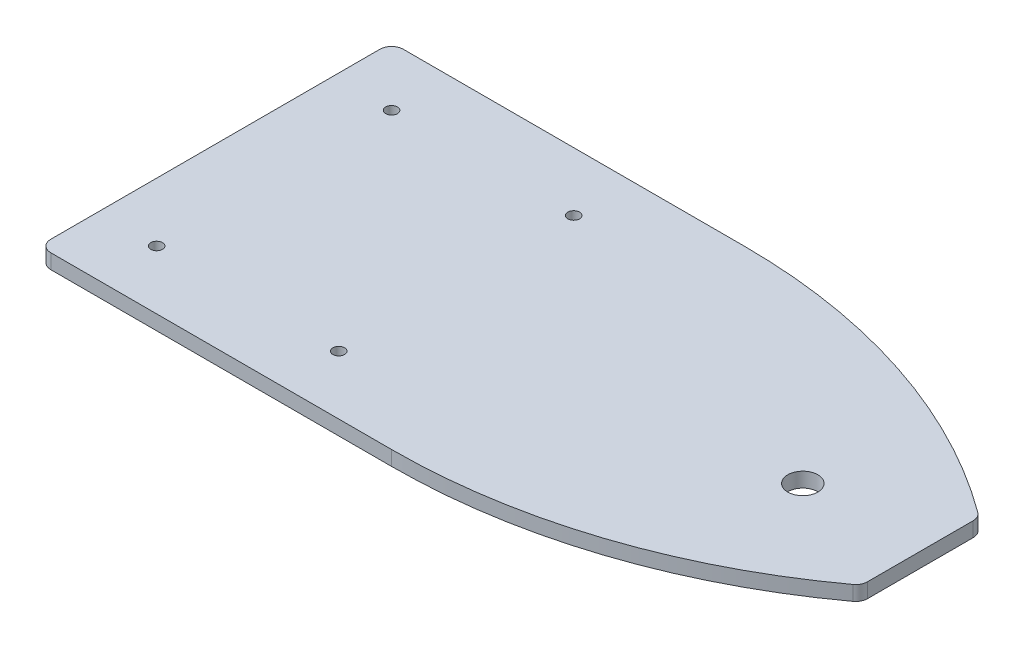
ISO-10303-21;
HEADER;
FILE_DESCRIPTION(('STEP AP214'),'2;1');
FILE_NAME('part.step','',(''),(''),'','','');
FILE_SCHEMA(('AUTOMOTIVE_DESIGN { 1 0 10303 214 1 1 1 1 }'));
ENDSEC;
DATA;
#1=APPLICATION_CONTEXT('core data for automotive mechanical design processes');
#2=APPLICATION_PROTOCOL_DEFINITION('international standard','automotive_design',2000,#1);
#3=PRODUCT_CONTEXT('',#1,'mechanical');
#4=PRODUCT('Part','Part','',(#3));
#5=PRODUCT_RELATED_PRODUCT_CATEGORY('part','',(#4));
#6=PRODUCT_DEFINITION_FORMATION('','',#4);
#7=PRODUCT_DEFINITION_CONTEXT('part definition',#1,'design');
#8=PRODUCT_DEFINITION('design','',#6,#7);
#9=PRODUCT_DEFINITION_SHAPE('','',#8);
#10=(LENGTH_UNIT() NAMED_UNIT(*) SI_UNIT(.MILLI.,.METRE.));
#11=(NAMED_UNIT(*) PLANE_ANGLE_UNIT() SI_UNIT($,.RADIAN.));
#12=(NAMED_UNIT(*) SI_UNIT($,.STERADIAN.) SOLID_ANGLE_UNIT());
#13=UNCERTAINTY_MEASURE_WITH_UNIT(LENGTH_MEASURE(1.E-05),#10,'distance_accuracy_value','');
#14=(GEOMETRIC_REPRESENTATION_CONTEXT(3) GLOBAL_UNCERTAINTY_ASSIGNED_CONTEXT((#13)) GLOBAL_UNIT_ASSIGNED_CONTEXT((#10,
#11,#12)) REPRESENTATION_CONTEXT('',''));
#15=CARTESIAN_POINT('',(0.,0.,0.));
#16=DIRECTION('',(0.,0.,1.));
#17=DIRECTION('',(1.,0.,0.));
#18=AXIS2_PLACEMENT_3D('',#15,#16,#17);
#19=CARTESIAN_POINT('',(76.2,3.175,38.1));
#20=DIRECTION('',(-1.,0.,0.));
#21=DIRECTION('',(0.,0.,1.));
#22=AXIS2_PLACEMENT_3D('',#19,#20,#21);
#23=PLANE('',#22);
#24=DIRECTION('',(0.,0.,-1.));
#25=VECTOR('',#24,1.);
#26=CARTESIAN_POINT('',(76.2,3.175,38.1));
#27=LINE('',#26,#25);
#28=CARTESIAN_POINT('',(76.2,3.175,11.421961703308));
#29=VERTEX_POINT('',#28);
#30=CARTESIAN_POINT('',(76.2,3.175,-11.421961703308));
#31=VERTEX_POINT('',#30);
#32=EDGE_CURVE('E196',#29,#31,#27,.T.);
#33=ORIENTED_EDGE('',*,*,#32,.F.);
#34=DIRECTION('',(0.,1.,0.));
#35=VECTOR('',#34,1.);
#36=CARTESIAN_POINT('',(76.2,3.175,11.421961703308));
#37=LINE('',#36,#35);
#38=CARTESIAN_POINT('',(76.2,0.,11.421961703308));
#39=VERTEX_POINT('',#38);
#40=EDGE_CURVE('E165',#29,#39,#37,.F.);
#41=ORIENTED_EDGE('',*,*,#40,.T.);
#42=DIRECTION('',(0.,0.,-1.));
#43=VECTOR('',#42,1.);
#44=CARTESIAN_POINT('',(76.2,0.,38.1));
#45=LINE('',#44,#43);
#46=CARTESIAN_POINT('',(76.2,0.,-11.421961703308));
#47=VERTEX_POINT('',#46);
#48=EDGE_CURVE('E143',#39,#47,#45,.T.);
#49=ORIENTED_EDGE('',*,*,#48,.T.);
#50=DIRECTION('',(0.,1.,0.));
#51=VECTOR('',#50,1.);
#52=CARTESIAN_POINT('',(76.2,3.175,-11.421961703308));
#53=LINE('',#52,#51);
#54=EDGE_CURVE('E163',#47,#31,#53,.T.);
#55=ORIENTED_EDGE('',*,*,#54,.T.);
#56=EDGE_LOOP('',(#33,#41,#49,#55));
#57=FACE_BOUND('',#56,.T.);
#58=ADVANCED_FACE('F43',(#57),#23,.F.);
#59=CARTESIAN_POINT('',(76.2,3.175,-38.1));
#60=DIRECTION('',(0.,0.,1.));
#61=DIRECTION('',(1.,0.,0.));
#62=AXIS2_PLACEMENT_3D('',#59,#60,#61);
#63=PLANE('',#62);
#64=DIRECTION('',(-1.,0.,0.));
#65=VECTOR('',#64,1.);
#66=CARTESIAN_POINT('',(76.2,0.,-38.1));
#67=LINE('',#66,#65);
#68=CARTESIAN_POINT('',(0.,0.,-38.1));
#69=VERTEX_POINT('',#68);
#70=CARTESIAN_POINT('',(-73.6599999999999,0.,-38.1));
#71=VERTEX_POINT('',#70);
#72=EDGE_CURVE('E135',#69,#71,#67,.T.);
#73=ORIENTED_EDGE('',*,*,#72,.T.);
#74=DIRECTION('',(0.,-1.,0.));
#75=VECTOR('',#74,1.);
#76=CARTESIAN_POINT('',(-73.66,3.175,-38.1));
#77=LINE('',#76,#75);
#78=CARTESIAN_POINT('',(-73.6599999999999,3.175,-38.1));
#79=VERTEX_POINT('',#78);
#80=EDGE_CURVE('E11',#71,#79,#77,.F.);
#81=ORIENTED_EDGE('',*,*,#80,.T.);
#82=DIRECTION('',(-1.,0.,0.));
#83=VECTOR('',#82,1.);
#84=CARTESIAN_POINT('',(76.2,3.175,-38.1));
#85=LINE('',#84,#83);
#86=CARTESIAN_POINT('',(0.,3.175,-38.1));
#87=VERTEX_POINT('',#86);
#88=EDGE_CURVE('E138',#87,#79,#85,.T.);
#89=ORIENTED_EDGE('',*,*,#88,.F.);
#90=DIRECTION('',(0.,1.,0.));
#91=VECTOR('',#90,1.);
#92=CARTESIAN_POINT('',(0.,0.,-38.1));
#93=LINE('',#92,#91);
#94=EDGE_CURVE('E123',#69,#87,#93,.T.);
#95=ORIENTED_EDGE('',*,*,#94,.F.);
#96=EDGE_LOOP('',(#73,#81,#89,#95));
#97=FACE_BOUND('',#96,.T.);
#98=ADVANCED_FACE('F133',(#97),#63,.F.);
#99=CARTESIAN_POINT('',(0.,3.175,0.));
#100=DIRECTION('',(0.,1.,0.));
#101=DIRECTION('',(0.,0.,1.));
#102=AXIS2_PLACEMENT_3D('',#99,#100,#101);
#103=PLANE('',#102);
#104=CARTESIAN_POINT('',(-63.5,3.175,25.4));
#105=DIRECTION('',(0.,1.,0.));
#106=DIRECTION('',(0.,0.,1.));
#107=AXIS2_PLACEMENT_3D('',#104,#105,#106);
#108=CIRCLE('',#107,1.27);
#109=CARTESIAN_POINT('',(-63.5,3.175,26.67));
#110=VERTEX_POINT('',#109);
#111=EDGE_CURVE('E217',#110,#110,#108,.T.);
#112=ORIENTED_EDGE('',*,*,#111,.F.);
#113=EDGE_LOOP('',(#112));
#114=FACE_BOUND('',#113,.T.);
#115=CARTESIAN_POINT('',(-24.13,3.175,-25.4));
#116=DIRECTION('',(0.,1.,0.));
#117=DIRECTION('',(0.,0.,1.));
#118=AXIS2_PLACEMENT_3D('',#115,#116,#117);
#119=CIRCLE('',#118,1.27);
#120=CARTESIAN_POINT('',(-24.13,3.175,-24.13));
#121=VERTEX_POINT('',#120);
#122=EDGE_CURVE('E222',#121,#121,#119,.T.);
#123=ORIENTED_EDGE('',*,*,#122,.F.);
#124=EDGE_LOOP('',(#123));
#125=FACE_BOUND('',#124,.T.);
#126=CARTESIAN_POINT('',(-24.13,3.175,25.4));
#127=DIRECTION('',(0.,1.,0.));
#128=DIRECTION('',(0.,0.,1.));
#129=AXIS2_PLACEMENT_3D('',#126,#127,#128);
#130=CIRCLE('',#129,1.27);
#131=CARTESIAN_POINT('',(-24.13,3.175,26.67));
#132=VERTEX_POINT('',#131);
#133=EDGE_CURVE('E225',#132,#132,#130,.T.);
#134=ORIENTED_EDGE('',*,*,#133,.F.);
#135=EDGE_LOOP('',(#134));
#136=FACE_BOUND('',#135,.T.);
#137=CARTESIAN_POINT('',(-63.5,3.175,-25.4));
#138=DIRECTION('',(0.,1.,0.));
#139=DIRECTION('',(0.,0.,1.));
#140=AXIS2_PLACEMENT_3D('',#137,#138,#139);
#141=CIRCLE('',#140,1.27);
#142=CARTESIAN_POINT('',(-63.5,3.175,-24.13));
#143=VERTEX_POINT('',#142);
#144=EDGE_CURVE('E211',#143,#143,#141,.T.);
#145=ORIENTED_EDGE('',*,*,#144,.F.);
#146=EDGE_LOOP('',(#145));
#147=FACE_BOUND('',#146,.T.);
#148=DIRECTION('',(0.,0.,1.));
#149=VECTOR('',#148,1.);
#150=CARTESIAN_POINT('',(-76.2,3.175,38.1));
#151=LINE('',#150,#149);
#152=CARTESIAN_POINT('',(-76.2,3.175,-35.56));
#153=VERTEX_POINT('',#152);
#154=CARTESIAN_POINT('',(-76.2,3.175,35.56));
#155=VERTEX_POINT('',#154);
#156=EDGE_CURVE('E144',#153,#155,#151,.T.);
#157=ORIENTED_EDGE('',*,*,#156,.T.);
#158=CARTESIAN_POINT('',(-73.66,3.175,35.56));
#159=DIRECTION('',(0.,1.,0.));
#160=DIRECTION('',(0.,0.,1.));
#161=AXIS2_PLACEMENT_3D('',#158,#159,#160);
#162=CIRCLE('',#161,2.54);
#163=CARTESIAN_POINT('',(-73.6599999999999,3.175,38.1));
#164=VERTEX_POINT('',#163);
#165=EDGE_CURVE('E51',#155,#164,#162,.T.);
#166=ORIENTED_EDGE('',*,*,#165,.T.);
#167=DIRECTION('',(1.,0.,0.));
#168=VECTOR('',#167,1.);
#169=CARTESIAN_POINT('',(76.2,3.175,38.1));
#170=LINE('',#169,#168);
#171=CARTESIAN_POINT('',(0.,3.175,38.1));
#172=VERTEX_POINT('',#171);
#173=EDGE_CURVE('E150',#164,#172,#170,.T.);
#174=ORIENTED_EDGE('',*,*,#173,.T.);
#175=CARTESIAN_POINT('',(0.,3.175,-88.9));
#176=DIRECTION('',(0.,-1.,0.));
#177=DIRECTION('',(0.,0.,1.));
#178=AXIS2_PLACEMENT_3D('',#175,#176,#177);
#179=CIRCLE('',#178,127.);
#180=CARTESIAN_POINT('',(75.1632653061225,3.175,13.4693486768449));
#181=VERTEX_POINT('',#180);
#182=EDGE_CURVE('E209',#181,#172,#179,.T.);
#183=ORIENTED_EDGE('',*,*,#182,.F.);
#184=CARTESIAN_POINT('',(73.66,3.175,11.421961703308));
#185=DIRECTION('',(0.,1.,0.));
#186=DIRECTION('',(0.,0.,1.));
#187=AXIS2_PLACEMENT_3D('',#184,#185,#186);
#188=CIRCLE('',#187,2.54);
#189=EDGE_CURVE('E160',#181,#29,#188,.T.);
#190=ORIENTED_EDGE('',*,*,#189,.T.);
#191=ORIENTED_EDGE('',*,*,#32,.T.);
#192=CARTESIAN_POINT('',(73.66,3.175,-11.421961703308));
#193=DIRECTION('',(0.,1.,0.));
#194=DIRECTION('',(0.,0.,1.));
#195=AXIS2_PLACEMENT_3D('',#192,#193,#194);
#196=CIRCLE('',#195,2.54);
#197=CARTESIAN_POINT('',(75.1632653061225,3.175,-13.469348676845));
#198=VERTEX_POINT('',#197);
#199=EDGE_CURVE('E159',#31,#198,#196,.T.);
#200=ORIENTED_EDGE('',*,*,#199,.T.);
#201=CARTESIAN_POINT('',(0.,3.175,88.9));
#202=DIRECTION('',(0.,-1.,0.));
#203=DIRECTION('',(0.,0.,-1.));
#204=AXIS2_PLACEMENT_3D('',#201,#202,#203);
#205=CIRCLE('',#204,127.);
#206=EDGE_CURVE('E132',#87,#198,#205,.T.);
#207=ORIENTED_EDGE('',*,*,#206,.F.);
#208=ORIENTED_EDGE('',*,*,#88,.T.);
#209=CARTESIAN_POINT('',(-73.66,3.175,-35.56));
#210=DIRECTION('',(0.,1.,0.));
#211=DIRECTION('',(0.,0.,1.));
#212=AXIS2_PLACEMENT_3D('',#209,#210,#211);
#213=CIRCLE('',#212,2.54);
#214=EDGE_CURVE('E181',#79,#153,#213,.T.);
#215=ORIENTED_EDGE('',*,*,#214,.T.);
#216=EDGE_LOOP('',(#157,#166,#174,#183,#190,#191,#200,#207,#208,#215));
#217=FACE_BOUND('',#216,.T.);
#218=CARTESIAN_POINT('',(50.8,3.175,0.));
#219=DIRECTION('',(0.,1.,0.));
#220=DIRECTION('',(0.,0.,1.));
#221=AXIS2_PLACEMENT_3D('',#218,#219,#220);
#222=CIRCLE('',#221,3.25);
#223=CARTESIAN_POINT('',(50.8,3.175,3.25));
#224=VERTEX_POINT('',#223);
#225=EDGE_CURVE('E232',#224,#224,#222,.F.);
#226=ORIENTED_EDGE('',*,*,#225,.T.);
#227=EDGE_LOOP('',(#226));
#228=FACE_BOUND('',#227,.T.);
#229=ADVANCED_FACE('F184',(#114,#125,#136,#147,#217,#228),#103,.T.);
#230=CARTESIAN_POINT('',(0.,0.,0.));
#231=DIRECTION('',(0.,1.,0.));
#232=DIRECTION('',(0.,0.,1.));
#233=AXIS2_PLACEMENT_3D('',#230,#231,#232);
#234=PLANE('',#233);
#235=CARTESIAN_POINT('',(-63.5,0.,25.4));
#236=DIRECTION('',(0.,1.,0.));
#237=DIRECTION('',(0.,0.,1.));
#238=AXIS2_PLACEMENT_3D('',#235,#236,#237);
#239=CIRCLE('',#238,1.27);
#240=CARTESIAN_POINT('',(-63.5,0.,26.67));
#241=VERTEX_POINT('',#240);
#242=EDGE_CURVE('E227',#241,#241,#239,.T.);
#243=ORIENTED_EDGE('',*,*,#242,.T.);
#244=EDGE_LOOP('',(#243));
#245=FACE_BOUND('',#244,.T.);
#246=CARTESIAN_POINT('',(-24.13,0.,-25.4));
#247=DIRECTION('',(0.,1.,0.));
#248=DIRECTION('',(0.,0.,1.));
#249=AXIS2_PLACEMENT_3D('',#246,#247,#248);
#250=CIRCLE('',#249,1.27);
#251=CARTESIAN_POINT('',(-24.13,0.,-24.13));
#252=VERTEX_POINT('',#251);
#253=EDGE_CURVE('E220',#252,#252,#250,.T.);
#254=ORIENTED_EDGE('',*,*,#253,.T.);
#255=EDGE_LOOP('',(#254));
#256=FACE_BOUND('',#255,.T.);
#257=CARTESIAN_POINT('',(-24.13,0.,25.4));
#258=DIRECTION('',(0.,1.,0.));
#259=DIRECTION('',(0.,0.,1.));
#260=AXIS2_PLACEMENT_3D('',#257,#258,#259);
#261=CIRCLE('',#260,1.27);
#262=CARTESIAN_POINT('',(-24.13,0.,26.67));
#263=VERTEX_POINT('',#262);
#264=EDGE_CURVE('E235',#263,#263,#261,.T.);
#265=ORIENTED_EDGE('',*,*,#264,.T.);
#266=EDGE_LOOP('',(#265));
#267=FACE_BOUND('',#266,.T.);
#268=CARTESIAN_POINT('',(-63.5,0.,-25.4));
#269=DIRECTION('',(0.,1.,0.));
#270=DIRECTION('',(0.,0.,1.));
#271=AXIS2_PLACEMENT_3D('',#268,#269,#270);
#272=CIRCLE('',#271,1.27);
#273=CARTESIAN_POINT('',(-63.5,0.,-24.13));
#274=VERTEX_POINT('',#273);
#275=EDGE_CURVE('E212',#274,#274,#272,.T.);
#276=ORIENTED_EDGE('',*,*,#275,.T.);
#277=EDGE_LOOP('',(#276));
#278=FACE_BOUND('',#277,.T.);
#279=DIRECTION('',(1.,0.,0.));
#280=VECTOR('',#279,1.);
#281=CARTESIAN_POINT('',(76.2,0.,38.1));
#282=LINE('',#281,#280);
#283=CARTESIAN_POINT('',(-73.6599999999999,0.,38.1));
#284=VERTEX_POINT('',#283);
#285=CARTESIAN_POINT('',(0.,0.,38.0999999999999));
#286=VERTEX_POINT('',#285);
#287=EDGE_CURVE('E148',#284,#286,#282,.T.);
#288=ORIENTED_EDGE('',*,*,#287,.F.);
#289=CARTESIAN_POINT('',(-73.66,0.,35.56));
#290=DIRECTION('',(0.,1.,0.));
#291=DIRECTION('',(0.,0.,1.));
#292=AXIS2_PLACEMENT_3D('',#289,#290,#291);
#293=CIRCLE('',#292,2.54);
#294=CARTESIAN_POINT('',(-76.2,0.,35.56));
#295=VERTEX_POINT('',#294);
#296=EDGE_CURVE('E174',#284,#295,#293,.F.);
#297=ORIENTED_EDGE('',*,*,#296,.T.);
#298=DIRECTION('',(0.,0.,1.));
#299=VECTOR('',#298,1.);
#300=CARTESIAN_POINT('',(-76.2,0.,38.1));
#301=LINE('',#300,#299);
#302=CARTESIAN_POINT('',(-76.2,0.,-35.56));
#303=VERTEX_POINT('',#302);
#304=EDGE_CURVE('E139',#303,#295,#301,.T.);
#305=ORIENTED_EDGE('',*,*,#304,.F.);
#306=CARTESIAN_POINT('',(-73.66,0.,-35.56));
#307=DIRECTION('',(0.,1.,0.));
#308=DIRECTION('',(0.,0.,1.));
#309=AXIS2_PLACEMENT_3D('',#306,#307,#308);
#310=CIRCLE('',#309,2.54);
#311=EDGE_CURVE('E141',#303,#71,#310,.F.);
#312=ORIENTED_EDGE('',*,*,#311,.T.);
#313=ORIENTED_EDGE('',*,*,#72,.F.);
#314=CARTESIAN_POINT('',(0.,0.,88.9));
#315=DIRECTION('',(0.,-1.,0.));
#316=DIRECTION('',(0.,0.,-1.));
#317=AXIS2_PLACEMENT_3D('',#314,#315,#316);
#318=CIRCLE('',#317,127.);
#319=CARTESIAN_POINT('',(75.1632653061225,0.,-13.469348676845));
#320=VERTEX_POINT('',#319);
#321=EDGE_CURVE('E122',#69,#320,#318,.T.);
#322=ORIENTED_EDGE('',*,*,#321,.T.);
#323=CARTESIAN_POINT('',(73.66,0.,-11.421961703308));
#324=DIRECTION('',(0.,1.,0.));
#325=DIRECTION('',(0.,0.,1.));
#326=AXIS2_PLACEMENT_3D('',#323,#324,#325);
#327=CIRCLE('',#326,2.54);
#328=EDGE_CURVE('E168',#320,#47,#327,.F.);
#329=ORIENTED_EDGE('',*,*,#328,.T.);
#330=ORIENTED_EDGE('',*,*,#48,.F.);
#331=CARTESIAN_POINT('',(73.66,0.,11.421961703308));
#332=DIRECTION('',(0.,1.,0.));
#333=DIRECTION('',(0.,0.,1.));
#334=AXIS2_PLACEMENT_3D('',#331,#332,#333);
#335=CIRCLE('',#334,2.54);
#336=CARTESIAN_POINT('',(75.1632653061225,0.,13.4693486768449));
#337=VERTEX_POINT('',#336);
#338=EDGE_CURVE('E166',#39,#337,#335,.F.);
#339=ORIENTED_EDGE('',*,*,#338,.T.);
#340=CARTESIAN_POINT('',(0.,0.,-88.9));
#341=DIRECTION('',(0.,-1.,0.));
#342=DIRECTION('',(0.,0.,1.));
#343=AXIS2_PLACEMENT_3D('',#340,#341,#342);
#344=CIRCLE('',#343,127.);
#345=EDGE_CURVE('E210',#337,#286,#344,.T.);
#346=ORIENTED_EDGE('',*,*,#345,.T.);
#347=EDGE_LOOP('',(#288,#297,#305,#312,#313,#322,#329,#330,#339,#346));
#348=FACE_BOUND('',#347,.T.);
#349=CARTESIAN_POINT('',(50.8,0.,0.));
#350=DIRECTION('',(0.,-1.,0.));
#351=DIRECTION('',(0.,0.,-0.999999999999994));
#352=AXIS2_PLACEMENT_3D('',#349,#350,#351);
#353=CIRCLE('',#352,3.25);
#354=CARTESIAN_POINT('',(50.8,0.,-3.24999999999998));
#355=VERTEX_POINT('',#354);
#356=EDGE_CURVE('E239',#355,#355,#353,.T.);
#357=ORIENTED_EDGE('',*,*,#356,.F.);
#358=EDGE_LOOP('',(#357));
#359=FACE_BOUND('',#358,.T.);
#360=ADVANCED_FACE('F136',(#245,#256,#267,#278,#348,#359),#234,.F.);
#361=CARTESIAN_POINT('',(-76.2,3.175,38.1));
#362=DIRECTION('',(1.,0.,0.));
#363=DIRECTION('',(0.,0.,-1.));
#364=AXIS2_PLACEMENT_3D('',#361,#362,#363);
#365=PLANE('',#364);
#366=ORIENTED_EDGE('',*,*,#304,.T.);
#367=DIRECTION('',(0.,-1.,0.));
#368=VECTOR('',#367,1.);
#369=CARTESIAN_POINT('',(-76.2,3.175,35.56));
#370=LINE('',#369,#368);
#371=EDGE_CURVE('E61',#295,#155,#370,.F.);
#372=ORIENTED_EDGE('',*,*,#371,.T.);
#373=ORIENTED_EDGE('',*,*,#156,.F.);
#374=DIRECTION('',(0.,-1.,0.));
#375=VECTOR('',#374,1.);
#376=CARTESIAN_POINT('',(-76.2,3.175,-35.56));
#377=LINE('',#376,#375);
#378=EDGE_CURVE('E180',#153,#303,#377,.T.);
#379=ORIENTED_EDGE('',*,*,#378,.T.);
#380=EDGE_LOOP('',(#366,#372,#373,#379));
#381=FACE_BOUND('',#380,.T.);
#382=ADVANCED_FACE('F200',(#381),#365,.F.);
#383=CARTESIAN_POINT('',(76.2,3.175,38.1));
#384=DIRECTION('',(0.,0.,-1.));
#385=DIRECTION('',(-1.,0.,0.));
#386=AXIS2_PLACEMENT_3D('',#383,#384,#385);
#387=PLANE('',#386);
#388=ORIENTED_EDGE('',*,*,#173,.F.);
#389=DIRECTION('',(0.,-1.,0.));
#390=VECTOR('',#389,1.);
#391=CARTESIAN_POINT('',(-73.66,3.175,38.1));
#392=LINE('',#391,#390);
#393=EDGE_CURVE('E171',#164,#284,#392,.T.);
#394=ORIENTED_EDGE('',*,*,#393,.T.);
#395=ORIENTED_EDGE('',*,*,#287,.T.);
#396=DIRECTION('',(0.,1.,0.));
#397=VECTOR('',#396,1.);
#398=CARTESIAN_POINT('',(0.,0.,38.1));
#399=LINE('',#398,#397);
#400=EDGE_CURVE('E193',#286,#172,#399,.T.);
#401=ORIENTED_EDGE('',*,*,#400,.T.);
#402=EDGE_LOOP('',(#388,#394,#395,#401));
#403=FACE_BOUND('',#402,.T.);
#404=ADVANCED_FACE('F194',(#403),#387,.F.);
#405=CARTESIAN_POINT('',(0.,0.,-88.9));
#406=DIRECTION('',(0.,1.,0.));
#407=DIRECTION('',(0.,0.,1.));
#408=AXIS2_PLACEMENT_3D('',#405,#406,#407);
#409=CYLINDRICAL_SURFACE('',#408,127.);
#410=ORIENTED_EDGE('',*,*,#345,.F.);
#411=DIRECTION('',(0.,1.,0.));
#412=VECTOR('',#411,1.);
#413=CARTESIAN_POINT('',(75.1632653061225,0.,13.4693486768449));
#414=LINE('',#413,#412);
#415=EDGE_CURVE('E153',#337,#181,#414,.T.);
#416=ORIENTED_EDGE('',*,*,#415,.T.);
#417=ORIENTED_EDGE('',*,*,#182,.T.);
#418=ORIENTED_EDGE('',*,*,#400,.F.);
#419=EDGE_LOOP('',(#410,#416,#417,#418));
#420=FACE_BOUND('',#419,.T.);
#421=ADVANCED_FACE('F270',(#420),#409,.T.);
#422=CARTESIAN_POINT('',(0.,0.,88.9));
#423=DIRECTION('',(0.,1.,0.));
#424=DIRECTION('',(0.,0.,1.));
#425=AXIS2_PLACEMENT_3D('',#422,#423,#424);
#426=CYLINDRICAL_SURFACE('',#425,127.);
#427=ORIENTED_EDGE('',*,*,#206,.T.);
#428=DIRECTION('',(0.,1.,0.));
#429=VECTOR('',#428,1.);
#430=CARTESIAN_POINT('',(75.1632653061225,0.,-13.469348676845));
#431=LINE('',#430,#429);
#432=EDGE_CURVE('E129',#198,#320,#431,.F.);
#433=ORIENTED_EDGE('',*,*,#432,.T.);
#434=ORIENTED_EDGE('',*,*,#321,.F.);
#435=ORIENTED_EDGE('',*,*,#94,.T.);
#436=EDGE_LOOP('',(#427,#433,#434,#435));
#437=FACE_BOUND('',#436,.T.);
#438=ADVANCED_FACE('F121',(#437),#426,.T.);
#439=CARTESIAN_POINT('',(73.66,0.,11.421961703308));
#440=DIRECTION('',(0.,1.,0.));
#441=DIRECTION('',(0.,0.,1.));
#442=AXIS2_PLACEMENT_3D('',#439,#440,#441);
#443=CYLINDRICAL_SURFACE('',#442,2.54);
#444=ORIENTED_EDGE('',*,*,#338,.F.);
#445=ORIENTED_EDGE('',*,*,#40,.F.);
#446=ORIENTED_EDGE('',*,*,#189,.F.);
#447=ORIENTED_EDGE('',*,*,#415,.F.);
#448=EDGE_LOOP('',(#444,#445,#446,#447));
#449=FACE_BOUND('',#448,.T.);
#450=ADVANCED_FACE('F272',(#449),#443,.T.);
#451=CARTESIAN_POINT('',(73.66,0.,-11.421961703308));
#452=DIRECTION('',(0.,1.,0.));
#453=DIRECTION('',(0.,0.,1.));
#454=AXIS2_PLACEMENT_3D('',#451,#452,#453);
#455=CYLINDRICAL_SURFACE('',#454,2.54);
#456=ORIENTED_EDGE('',*,*,#328,.F.);
#457=ORIENTED_EDGE('',*,*,#432,.F.);
#458=ORIENTED_EDGE('',*,*,#199,.F.);
#459=ORIENTED_EDGE('',*,*,#54,.F.);
#460=EDGE_LOOP('',(#456,#457,#458,#459));
#461=FACE_BOUND('',#460,.T.);
#462=ADVANCED_FACE('F274',(#461),#455,.T.);
#463=CARTESIAN_POINT('',(-73.66,3.175,35.56));
#464=DIRECTION('',(0.,-1.,0.));
#465=DIRECTION('',(0.,0.,-1.));
#466=AXIS2_PLACEMENT_3D('',#463,#464,#465);
#467=CYLINDRICAL_SURFACE('',#466,2.54);
#468=ORIENTED_EDGE('',*,*,#165,.F.);
#469=ORIENTED_EDGE('',*,*,#371,.F.);
#470=ORIENTED_EDGE('',*,*,#296,.F.);
#471=ORIENTED_EDGE('',*,*,#393,.F.);
#472=EDGE_LOOP('',(#468,#469,#470,#471));
#473=FACE_BOUND('',#472,.T.);
#474=ADVANCED_FACE('F199',(#473),#467,.T.);
#475=CARTESIAN_POINT('',(-73.66,3.175,-35.56));
#476=DIRECTION('',(0.,-1.,0.));
#477=DIRECTION('',(0.,0.,-1.));
#478=AXIS2_PLACEMENT_3D('',#475,#476,#477);
#479=CYLINDRICAL_SURFACE('',#478,2.54);
#480=ORIENTED_EDGE('',*,*,#214,.F.);
#481=ORIENTED_EDGE('',*,*,#80,.F.);
#482=ORIENTED_EDGE('',*,*,#311,.F.);
#483=ORIENTED_EDGE('',*,*,#378,.F.);
#484=EDGE_LOOP('',(#480,#481,#482,#483));
#485=FACE_BOUND('',#484,.T.);
#486=ADVANCED_FACE('F44',(#485),#479,.T.);
#487=CARTESIAN_POINT('',(-63.5,0.,-25.4));
#488=DIRECTION('',(0.,1.,0.));
#489=DIRECTION('',(0.,0.,1.));
#490=AXIS2_PLACEMENT_3D('',#487,#488,#489);
#491=CYLINDRICAL_SURFACE('',#490,1.27);
#492=ORIENTED_EDGE('',*,*,#275,.F.);
#493=EDGE_LOOP('',(#492));
#494=FACE_BOUND('',#493,.T.);
#495=ORIENTED_EDGE('',*,*,#144,.T.);
#496=EDGE_LOOP('',(#495));
#497=FACE_BOUND('',#496,.T.);
#498=ADVANCED_FACE('F282',(#494,#497),#491,.F.);
#499=CARTESIAN_POINT('',(-24.13,0.,25.4));
#500=DIRECTION('',(0.,1.,0.));
#501=DIRECTION('',(0.,0.,1.));
#502=AXIS2_PLACEMENT_3D('',#499,#500,#501);
#503=CYLINDRICAL_SURFACE('',#502,1.27);
#504=ORIENTED_EDGE('',*,*,#264,.F.);
#505=EDGE_LOOP('',(#504));
#506=FACE_BOUND('',#505,.T.);
#507=ORIENTED_EDGE('',*,*,#133,.T.);
#508=EDGE_LOOP('',(#507));
#509=FACE_BOUND('',#508,.T.);
#510=ADVANCED_FACE('F289',(#506,#509),#503,.F.);
#511=CARTESIAN_POINT('',(-24.13,0.,-25.4));
#512=DIRECTION('',(0.,1.,0.));
#513=DIRECTION('',(0.,0.,1.));
#514=AXIS2_PLACEMENT_3D('',#511,#512,#513);
#515=CYLINDRICAL_SURFACE('',#514,1.27);
#516=ORIENTED_EDGE('',*,*,#253,.F.);
#517=EDGE_LOOP('',(#516));
#518=FACE_BOUND('',#517,.T.);
#519=ORIENTED_EDGE('',*,*,#122,.T.);
#520=EDGE_LOOP('',(#519));
#521=FACE_BOUND('',#520,.T.);
#522=ADVANCED_FACE('F302',(#518,#521),#515,.F.);
#523=CARTESIAN_POINT('',(-63.5,0.,25.4));
#524=DIRECTION('',(0.,1.,0.));
#525=DIRECTION('',(0.,0.,1.));
#526=AXIS2_PLACEMENT_3D('',#523,#524,#525);
#527=CYLINDRICAL_SURFACE('',#526,1.27);
#528=ORIENTED_EDGE('',*,*,#242,.F.);
#529=EDGE_LOOP('',(#528));
#530=FACE_BOUND('',#529,.T.);
#531=ORIENTED_EDGE('',*,*,#111,.T.);
#532=EDGE_LOOP('',(#531));
#533=FACE_BOUND('',#532,.T.);
#534=ADVANCED_FACE('F310',(#530,#533),#527,.F.);
#535=CARTESIAN_POINT('',(50.8,24.7276146905658,0.));
#536=DIRECTION('',(0.,-1.,0.));
#537=DIRECTION('',(0.,0.,-1.));
#538=AXIS2_PLACEMENT_3D('',#535,#536,#537);
#539=CYLINDRICAL_SURFACE('',#538,3.25);
#540=ORIENTED_EDGE('',*,*,#356,.T.);
#541=EDGE_LOOP('',(#540));
#542=FACE_BOUND('',#541,.T.);
#543=ORIENTED_EDGE('',*,*,#225,.F.);
#544=EDGE_LOOP('',(#543));
#545=FACE_BOUND('',#544,.T.);
#546=ADVANCED_FACE('F242',(#542,#545),#539,.F.);
#547=CLOSED_SHELL('',(#58,#98,#229,#360,#382,#404,#421,#438,#450,#462,#474,#486,#498,#510,#522,
#534,#546));
#548=MANIFOLD_SOLID_BREP('B2',#547);
#549=ADVANCED_BREP_SHAPE_REPRESENTATION('',(#18,#548),#14);
#550=SHAPE_DEFINITION_REPRESENTATION(#9,#549);
ENDSEC;
END-ISO-10303-21;
